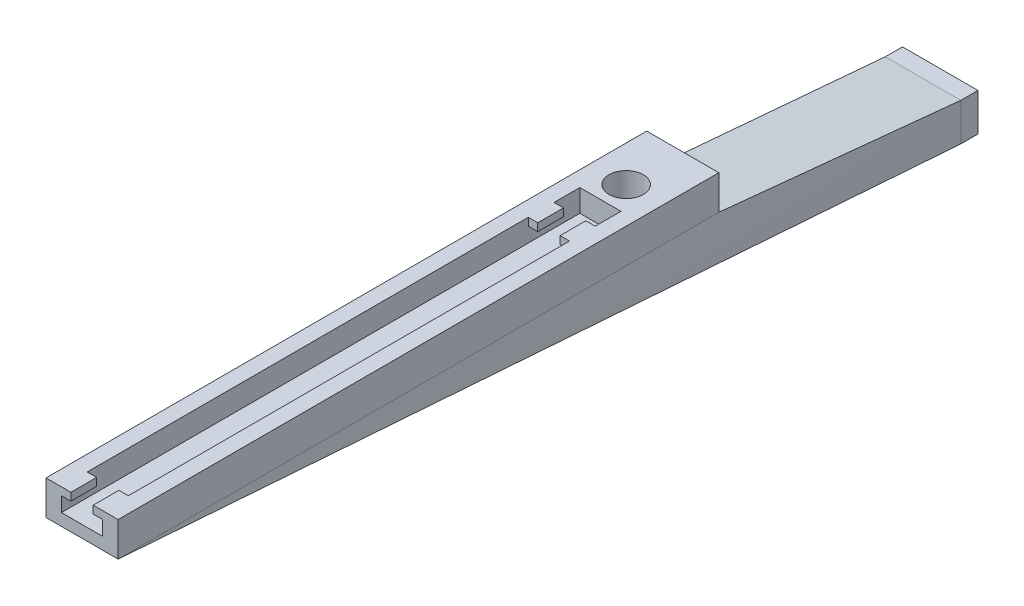
ISO-10303-21;
HEADER;
FILE_DESCRIPTION(('STEP AP214'),'2;1');
FILE_NAME('part.step','',(''),(''),'','','');
FILE_SCHEMA(('AUTOMOTIVE_DESIGN { 1 0 10303 214 1 1 1 1 }'));
ENDSEC;
DATA;
#1=APPLICATION_CONTEXT('core data for automotive mechanical design processes');
#2=APPLICATION_PROTOCOL_DEFINITION('international standard','automotive_design',2000,#1);
#3=PRODUCT_CONTEXT('',#1,'mechanical');
#4=PRODUCT('Part','Part','',(#3));
#5=PRODUCT_RELATED_PRODUCT_CATEGORY('part','',(#4));
#6=PRODUCT_DEFINITION_FORMATION('','',#4);
#7=PRODUCT_DEFINITION_CONTEXT('part definition',#1,'design');
#8=PRODUCT_DEFINITION('design','',#6,#7);
#9=PRODUCT_DEFINITION_SHAPE('','',#8);
#10=(LENGTH_UNIT() NAMED_UNIT(*) SI_UNIT(.MILLI.,.METRE.));
#11=(NAMED_UNIT(*) PLANE_ANGLE_UNIT() SI_UNIT($,.RADIAN.));
#12=(NAMED_UNIT(*) SI_UNIT($,.STERADIAN.) SOLID_ANGLE_UNIT());
#13=UNCERTAINTY_MEASURE_WITH_UNIT(LENGTH_MEASURE(1.E-05),#10,'distance_accuracy_value','');
#14=(GEOMETRIC_REPRESENTATION_CONTEXT(3) GLOBAL_UNCERTAINTY_ASSIGNED_CONTEXT((#13)) GLOBAL_UNIT_ASSIGNED_CONTEXT((#10,
#11,#12)) REPRESENTATION_CONTEXT('',''));
#15=CARTESIAN_POINT('',(0.,0.,0.));
#16=DIRECTION('',(0.,0.,1.));
#17=DIRECTION('',(1.,0.,0.));
#18=AXIS2_PLACEMENT_3D('',#15,#16,#17);
#19=CARTESIAN_POINT('',(3.25,22.,99.));
#20=DIRECTION('',(1.,0.,0.));
#21=DIRECTION('',(0.,1.,0.));
#22=AXIS2_PLACEMENT_3D('',#19,#20,#21);
#23=PLANE('',#22);
#24=DIRECTION('',(0.,1.,0.));
#25=VECTOR('',#24,1.);
#26=CARTESIAN_POINT('',(3.24999999999999,-5.5010249999999,106.5));
#27=LINE('',#26,#25);
#28=CARTESIAN_POINT('',(3.25,19.75,106.5));
#29=VERTEX_POINT('',#28);
#30=CARTESIAN_POINT('',(3.25,22.,106.5));
#31=VERTEX_POINT('',#30);
#32=EDGE_CURVE('E538',#29,#31,#27,.T.);
#33=ORIENTED_EDGE('',*,*,#32,.F.);
#34=DIRECTION('',(0.,0.,1.));
#35=VECTOR('',#34,1.);
#36=CARTESIAN_POINT('',(3.25,19.75,99.));
#37=LINE('',#36,#35);
#38=CARTESIAN_POINT('',(3.25,19.75,114.));
#39=VERTEX_POINT('',#38);
#40=EDGE_CURVE('E508',#29,#39,#37,.T.);
#41=ORIENTED_EDGE('',*,*,#40,.T.);
#42=DIRECTION('',(0.,-1.,0.));
#43=VECTOR('',#42,1.);
#44=CARTESIAN_POINT('',(3.24999999999999,-5.5010249999999,114.));
#45=LINE('',#44,#43);
#46=CARTESIAN_POINT('',(3.25,22.,114.));
#47=VERTEX_POINT('',#46);
#48=EDGE_CURVE('E566',#47,#39,#45,.T.);
#49=ORIENTED_EDGE('',*,*,#48,.F.);
#50=DIRECTION('',(0.,0.,1.));
#51=VECTOR('',#50,1.);
#52=CARTESIAN_POINT('',(3.25,22.,99.));
#53=LINE('',#52,#51);
#54=EDGE_CURVE('E263',#31,#47,#53,.T.);
#55=ORIENTED_EDGE('',*,*,#54,.F.);
#56=EDGE_LOOP('',(#33,#41,#49,#55));
#57=FACE_BOUND('',#56,.T.);
#58=ADVANCED_FACE('F50',(#57),#23,.F.);
#59=DIRECTION('',(0.,1.,0.));
#60=VECTOR('',#59,1.);
#61=CARTESIAN_POINT('',(3.24999999999999,-5.5010249999999,242.5));
#62=LINE('',#61,#60);
#63=CARTESIAN_POINT('',(3.25,19.75,242.5));
#64=VERTEX_POINT('',#63);
#65=CARTESIAN_POINT('',(3.25,22.,242.5));
#66=VERTEX_POINT('',#65);
#67=EDGE_CURVE('E568',#64,#66,#62,.T.);
#68=ORIENTED_EDGE('',*,*,#67,.F.);
#69=CARTESIAN_POINT('',(3.25,19.75,250.));
#70=VERTEX_POINT('',#69);
#71=EDGE_CURVE('E509',#64,#70,#37,.T.);
#72=ORIENTED_EDGE('',*,*,#71,.T.);
#73=DIRECTION('',(0.,1.,0.));
#74=VECTOR('',#73,1.);
#75=CARTESIAN_POINT('',(3.25,22.,250.));
#76=LINE('',#75,#74);
#77=CARTESIAN_POINT('',(3.25,22.,250.));
#78=VERTEX_POINT('',#77);
#79=EDGE_CURVE('E504',#70,#78,#76,.T.);
#80=ORIENTED_EDGE('',*,*,#79,.T.);
#81=EDGE_CURVE('E411',#66,#78,#53,.T.);
#82=ORIENTED_EDGE('',*,*,#81,.F.);
#83=EDGE_LOOP('',(#68,#72,#80,#82));
#84=FACE_BOUND('',#83,.T.);
#85=ADVANCED_FACE('F616',(#84),#23,.F.);
#86=CARTESIAN_POINT('',(3.25,19.75,99.));
#87=DIRECTION('',(0.,1.,0.));
#88=DIRECTION('',(0.,0.,1.));
#89=AXIS2_PLACEMENT_3D('',#86,#87,#88);
#90=PLANE('',#89);
#91=DIRECTION('',(-1.,0.,0.));
#92=VECTOR('',#91,1.);
#93=CARTESIAN_POINT('',(6.0000000000011,19.75,106.5));
#94=LINE('',#93,#92);
#95=CARTESIAN_POINT('',(5.99999999999989,19.75,106.5));
#96=VERTEX_POINT('',#95);
#97=EDGE_CURVE('E537',#96,#29,#94,.T.);
#98=ORIENTED_EDGE('',*,*,#97,.F.);
#99=DIRECTION('',(0.,0.,1.));
#100=VECTOR('',#99,1.);
#101=CARTESIAN_POINT('',(5.99999999999989,19.75,99.));
#102=LINE('',#101,#100);
#103=CARTESIAN_POINT('',(5.99999999999989,19.75,114.));
#104=VERTEX_POINT('',#103);
#105=EDGE_CURVE('E515',#96,#104,#102,.T.);
#106=ORIENTED_EDGE('',*,*,#105,.T.);
#107=DIRECTION('',(1.,0.,0.));
#108=VECTOR('',#107,1.);
#109=CARTESIAN_POINT('',(-6.00000000000002,19.75,114.));
#110=LINE('',#109,#108);
#111=EDGE_CURVE('E564',#39,#104,#110,.T.);
#112=ORIENTED_EDGE('',*,*,#111,.F.);
#113=ORIENTED_EDGE('',*,*,#40,.F.);
#114=EDGE_LOOP('',(#98,#106,#112,#113));
#115=FACE_BOUND('',#114,.T.);
#116=ADVANCED_FACE('F600',(#115),#90,.F.);
#117=DIRECTION('',(-1.,0.,0.));
#118=VECTOR('',#117,1.);
#119=CARTESIAN_POINT('',(6.,19.75,242.5));
#120=LINE('',#119,#118);
#121=CARTESIAN_POINT('',(5.99999999999989,19.75,242.5));
#122=VERTEX_POINT('',#121);
#123=EDGE_CURVE('E563',#122,#64,#120,.T.);
#124=ORIENTED_EDGE('',*,*,#123,.F.);
#125=CARTESIAN_POINT('',(5.99999999999989,19.75,250.));
#126=VERTEX_POINT('',#125);
#127=EDGE_CURVE('E514',#122,#126,#102,.T.);
#128=ORIENTED_EDGE('',*,*,#127,.T.);
#129=DIRECTION('',(-1.,0.,0.));
#130=VECTOR('',#129,1.);
#131=CARTESIAN_POINT('',(3.25,19.75,250.));
#132=LINE('',#131,#130);
#133=EDGE_CURVE('E505',#126,#70,#132,.T.);
#134=ORIENTED_EDGE('',*,*,#133,.T.);
#135=ORIENTED_EDGE('',*,*,#71,.F.);
#136=EDGE_LOOP('',(#124,#128,#134,#135));
#137=FACE_BOUND('',#136,.T.);
#138=ADVANCED_FACE('F614',(#137),#90,.F.);
#139=CARTESIAN_POINT('',(-3.25,19.75,99.));
#140=DIRECTION('',(0.,1.,0.));
#141=DIRECTION('',(0.,0.,1.));
#142=AXIS2_PLACEMENT_3D('',#139,#140,#141);
#143=PLANE('',#142);
#144=DIRECTION('',(-1.,0.,0.));
#145=VECTOR('',#144,1.);
#146=CARTESIAN_POINT('',(6.,19.75,242.5));
#147=LINE('',#146,#145);
#148=CARTESIAN_POINT('',(-3.25,19.75,242.5));
#149=VERTEX_POINT('',#148);
#150=CARTESIAN_POINT('',(-5.99999999999989,19.75,242.5));
#151=VERTEX_POINT('',#150);
#152=EDGE_CURVE('E553',#149,#151,#147,.T.);
#153=ORIENTED_EDGE('',*,*,#152,.F.);
#154=DIRECTION('',(0.,0.,1.));
#155=VECTOR('',#154,1.);
#156=CARTESIAN_POINT('',(-3.25,19.75,99.));
#157=LINE('',#156,#155);
#158=CARTESIAN_POINT('',(-3.25,19.75,250.));
#159=VERTEX_POINT('',#158);
#160=EDGE_CURVE('E247',#149,#159,#157,.T.);
#161=ORIENTED_EDGE('',*,*,#160,.T.);
#162=DIRECTION('',(-1.,0.,0.));
#163=VECTOR('',#162,1.);
#164=CARTESIAN_POINT('',(-3.25,19.75,250.));
#165=LINE('',#164,#163);
#166=CARTESIAN_POINT('',(-5.99999999999989,19.75,250.));
#167=VERTEX_POINT('',#166);
#168=EDGE_CURVE('E483',#159,#167,#165,.T.);
#169=ORIENTED_EDGE('',*,*,#168,.T.);
#170=DIRECTION('',(0.,0.,1.));
#171=VECTOR('',#170,1.);
#172=CARTESIAN_POINT('',(-5.99999999999989,19.75,99.));
#173=LINE('',#172,#171);
#174=EDGE_CURVE('E250',#151,#167,#173,.T.);
#175=ORIENTED_EDGE('',*,*,#174,.F.);
#176=EDGE_LOOP('',(#153,#161,#169,#175));
#177=FACE_BOUND('',#176,.T.);
#178=ADVANCED_FACE('F643',(#177),#143,.F.);
#179=DIRECTION('',(1.,0.,0.));
#180=VECTOR('',#179,1.);
#181=CARTESIAN_POINT('',(-6.00000000000002,19.75,114.));
#182=LINE('',#181,#180);
#183=CARTESIAN_POINT('',(-5.99999999999989,19.75,114.));
#184=VERTEX_POINT('',#183);
#185=CARTESIAN_POINT('',(-3.25,19.75,114.));
#186=VERTEX_POINT('',#185);
#187=EDGE_CURVE('E555',#184,#186,#182,.T.);
#188=ORIENTED_EDGE('',*,*,#187,.F.);
#189=CARTESIAN_POINT('',(-5.99999999999989,19.75,106.5));
#190=VERTEX_POINT('',#189);
#191=EDGE_CURVE('E245',#190,#184,#173,.T.);
#192=ORIENTED_EDGE('',*,*,#191,.F.);
#193=DIRECTION('',(-1.,0.,0.));
#194=VECTOR('',#193,1.);
#195=CARTESIAN_POINT('',(6.0000000000011,19.75,106.5));
#196=LINE('',#195,#194);
#197=CARTESIAN_POINT('',(-3.25,19.75,106.5));
#198=VERTEX_POINT('',#197);
#199=EDGE_CURVE('E224',#198,#190,#196,.T.);
#200=ORIENTED_EDGE('',*,*,#199,.F.);
#201=EDGE_CURVE('E239',#198,#186,#157,.T.);
#202=ORIENTED_EDGE('',*,*,#201,.T.);
#203=EDGE_LOOP('',(#188,#192,#200,#202));
#204=FACE_BOUND('',#203,.T.);
#205=ADVANCED_FACE('F237',(#204),#143,.F.);
#206=CARTESIAN_POINT('',(-3.25,22.,99.));
#207=DIRECTION('',(-1.,0.,0.));
#208=DIRECTION('',(0.,-1.,0.));
#209=AXIS2_PLACEMENT_3D('',#206,#207,#208);
#210=PLANE('',#209);
#211=DIRECTION('',(0.,-1.,0.));
#212=VECTOR('',#211,1.);
#213=CARTESIAN_POINT('',(-3.24999999999999,-5.5010249999999,242.5));
#214=LINE('',#213,#212);
#215=CARTESIAN_POINT('',(-3.25,22.,242.5));
#216=VERTEX_POINT('',#215);
#217=EDGE_CURVE('E547',#216,#149,#214,.T.);
#218=ORIENTED_EDGE('',*,*,#217,.F.);
#219=DIRECTION('',(0.,0.,1.));
#220=VECTOR('',#219,1.);
#221=CARTESIAN_POINT('',(-3.25,22.,99.));
#222=LINE('',#221,#220);
#223=CARTESIAN_POINT('',(-3.25,22.,250.));
#224=VERTEX_POINT('',#223);
#225=EDGE_CURVE('E251',#216,#224,#222,.T.);
#226=ORIENTED_EDGE('',*,*,#225,.T.);
#227=DIRECTION('',(0.,-1.,0.));
#228=VECTOR('',#227,1.);
#229=CARTESIAN_POINT('',(-3.25,22.,250.));
#230=LINE('',#229,#228);
#231=EDGE_CURVE('E476',#224,#159,#230,.T.);
#232=ORIENTED_EDGE('',*,*,#231,.T.);
#233=ORIENTED_EDGE('',*,*,#160,.F.);
#234=EDGE_LOOP('',(#218,#226,#232,#233));
#235=FACE_BOUND('',#234,.T.);
#236=ADVANCED_FACE('F652',(#235),#210,.F.);
#237=DIRECTION('',(0.,1.,0.));
#238=VECTOR('',#237,1.);
#239=CARTESIAN_POINT('',(-3.24999999999999,-5.5010249999999,114.));
#240=LINE('',#239,#238);
#241=CARTESIAN_POINT('',(-3.25,22.,114.));
#242=VERTEX_POINT('',#241);
#243=EDGE_CURVE('E246',#186,#242,#240,.T.);
#244=ORIENTED_EDGE('',*,*,#243,.F.);
#245=ORIENTED_EDGE('',*,*,#201,.F.);
#246=DIRECTION('',(0.,-1.,0.));
#247=VECTOR('',#246,1.);
#248=CARTESIAN_POINT('',(-3.25,-5.5010249999999,106.5));
#249=LINE('',#248,#247);
#250=CARTESIAN_POINT('',(-3.25,22.,106.5));
#251=VERTEX_POINT('',#250);
#252=EDGE_CURVE('E225',#251,#198,#249,.T.);
#253=ORIENTED_EDGE('',*,*,#252,.F.);
#254=EDGE_CURVE('E252',#251,#242,#222,.T.);
#255=ORIENTED_EDGE('',*,*,#254,.T.);
#256=EDGE_LOOP('',(#244,#245,#253,#255));
#257=FACE_BOUND('',#256,.T.);
#258=ADVANCED_FACE('F244',(#257),#210,.F.);
#259=CARTESIAN_POINT('',(0.,22.,0.));
#260=DIRECTION('',(0.,1.,0.));
#261=DIRECTION('',(0.,0.,1.));
#262=AXIS2_PLACEMENT_3D('',#259,#260,#261);
#263=PLANE('',#262);
#264=DIRECTION('',(-1.,0.,0.));
#265=VECTOR('',#264,1.);
#266=CARTESIAN_POINT('',(-3.25,22.,99.));
#267=LINE('',#266,#265);
#268=CARTESIAN_POINT('',(6.00000000000105,22.,99.));
#269=VERTEX_POINT('',#268);
#270=CARTESIAN_POINT('',(-6.00000000000037,22.,99.));
#271=VERTEX_POINT('',#270);
#272=EDGE_CURVE('E510',#269,#271,#267,.T.);
#273=ORIENTED_EDGE('',*,*,#272,.F.);
#274=DIRECTION('',(0.,0.,-1.));
#275=VECTOR('',#274,1.);
#276=CARTESIAN_POINT('',(6.0000000000011,22.,106.5));
#277=LINE('',#276,#275);
#278=CARTESIAN_POINT('',(6.0000000000011,22.,106.5));
#279=VERTEX_POINT('',#278);
#280=EDGE_CURVE('E531',#279,#269,#277,.T.);
#281=ORIENTED_EDGE('',*,*,#280,.F.);
#282=DIRECTION('',(1.,0.,0.));
#283=VECTOR('',#282,1.);
#284=CARTESIAN_POINT('',(6.0000000000011,22.,106.5));
#285=LINE('',#284,#283);
#286=EDGE_CURVE('E61',#31,#279,#285,.T.);
#287=ORIENTED_EDGE('',*,*,#286,.F.);
#288=ORIENTED_EDGE('',*,*,#54,.T.);
#289=DIRECTION('',(-1.,0.,0.));
#290=VECTOR('',#289,1.);
#291=CARTESIAN_POINT('',(-6.00000000000002,22.,114.));
#292=LINE('',#291,#290);
#293=CARTESIAN_POINT('',(6.0000000000008,22.,114.));
#294=VERTEX_POINT('',#293);
#295=EDGE_CURVE('E535',#294,#47,#292,.T.);
#296=ORIENTED_EDGE('',*,*,#295,.F.);
#297=DIRECTION('',(0.,0.,-1.));
#298=VECTOR('',#297,1.);
#299=CARTESIAN_POINT('',(6.,22.,242.5));
#300=LINE('',#299,#298);
#301=CARTESIAN_POINT('',(6.,22.,242.5));
#302=VERTEX_POINT('',#301);
#303=EDGE_CURVE('E559',#302,#294,#300,.T.);
#304=ORIENTED_EDGE('',*,*,#303,.F.);
#305=DIRECTION('',(1.,0.,0.));
#306=VECTOR('',#305,1.);
#307=CARTESIAN_POINT('',(6.,22.,242.5));
#308=LINE('',#307,#306);
#309=EDGE_CURVE('E556',#66,#302,#308,.T.);
#310=ORIENTED_EDGE('',*,*,#309,.F.);
#311=ORIENTED_EDGE('',*,*,#81,.T.);
#312=DIRECTION('',(1.,0.,0.));
#313=VECTOR('',#312,1.);
#314=CARTESIAN_POINT('',(-10.5,22.,250.));
#315=LINE('',#314,#313);
#316=CARTESIAN_POINT('',(10.5,22.,250.));
#317=VERTEX_POINT('',#316);
#318=EDGE_CURVE('E270',#78,#317,#315,.T.);
#319=ORIENTED_EDGE('',*,*,#318,.T.);
#320=DIRECTION('',(0.,0.,-1.));
#321=VECTOR('',#320,1.);
#322=CARTESIAN_POINT('',(10.5,22.,75.));
#323=LINE('',#322,#321);
#324=CARTESIAN_POINT('',(10.5,22.,75.));
#325=VERTEX_POINT('',#324);
#326=EDGE_CURVE('E259',#317,#325,#323,.T.);
#327=ORIENTED_EDGE('',*,*,#326,.T.);
#328=DIRECTION('',(-1.,0.,0.));
#329=VECTOR('',#328,1.);
#330=CARTESIAN_POINT('',(-10.5,22.,75.));
#331=LINE('',#330,#329);
#332=CARTESIAN_POINT('',(-10.5,22.,75.));
#333=VERTEX_POINT('',#332);
#334=EDGE_CURVE('E256',#325,#333,#331,.T.);
#335=ORIENTED_EDGE('',*,*,#334,.T.);
#336=DIRECTION('',(0.,0.,1.));
#337=VECTOR('',#336,1.);
#338=CARTESIAN_POINT('',(-10.5,22.,75.));
#339=LINE('',#338,#337);
#340=CARTESIAN_POINT('',(-10.5,22.,250.));
#341=VERTEX_POINT('',#340);
#342=EDGE_CURVE('E262',#333,#341,#339,.T.);
#343=ORIENTED_EDGE('',*,*,#342,.T.);
#344=EDGE_CURVE('E266',#341,#224,#315,.T.);
#345=ORIENTED_EDGE('',*,*,#344,.T.);
#346=ORIENTED_EDGE('',*,*,#225,.F.);
#347=DIRECTION('',(1.,0.,0.));
#348=VECTOR('',#347,1.);
#349=CARTESIAN_POINT('',(6.,22.,242.5));
#350=LINE('',#349,#348);
#351=CARTESIAN_POINT('',(-6.,22.,242.5));
#352=VERTEX_POINT('',#351);
#353=EDGE_CURVE('E545',#352,#216,#350,.T.);
#354=ORIENTED_EDGE('',*,*,#353,.F.);
#355=DIRECTION('',(0.,0.,1.));
#356=VECTOR('',#355,1.);
#357=CARTESIAN_POINT('',(-6.,22.,242.5));
#358=LINE('',#357,#356);
#359=CARTESIAN_POINT('',(-6.00000000000002,22.,114.));
#360=VERTEX_POINT('',#359);
#361=EDGE_CURVE('E542',#360,#352,#358,.T.);
#362=ORIENTED_EDGE('',*,*,#361,.F.);
#363=DIRECTION('',(-1.,0.,0.));
#364=VECTOR('',#363,1.);
#365=CARTESIAN_POINT('',(-6.00000000000002,22.,114.));
#366=LINE('',#365,#364);
#367=EDGE_CURVE('E71',#242,#360,#366,.T.);
#368=ORIENTED_EDGE('',*,*,#367,.F.);
#369=ORIENTED_EDGE('',*,*,#254,.F.);
#370=DIRECTION('',(1.,0.,0.));
#371=VECTOR('',#370,1.);
#372=CARTESIAN_POINT('',(6.0000000000011,22.,106.5));
#373=LINE('',#372,#371);
#374=CARTESIAN_POINT('',(-6.00000000000037,22.,106.5));
#375=VERTEX_POINT('',#374);
#376=EDGE_CURVE('E226',#375,#251,#373,.T.);
#377=ORIENTED_EDGE('',*,*,#376,.F.);
#378=DIRECTION('',(0.,0.,1.));
#379=VECTOR('',#378,1.);
#380=CARTESIAN_POINT('',(-6.00000000000037,22.,106.5));
#381=LINE('',#380,#379);
#382=EDGE_CURVE('E528',#271,#375,#381,.T.);
#383=ORIENTED_EDGE('',*,*,#382,.F.);
#384=EDGE_LOOP('',(#273,#281,#287,#288,#296,#304,#310,#311,#319,#327,#335,#343,#345,#346,#354,
#362,#368,#369,#377,#383));
#385=FACE_BOUND('',#384,.T.);
#386=CARTESIAN_POINT('',(0.,22.,91.5));
#387=DIRECTION('',(0.,1.,0.));
#388=DIRECTION('',(0.,0.,1.));
#389=AXIS2_PLACEMENT_3D('',#386,#387,#388);
#390=CIRCLE('',#389,5.00000000000001);
#391=CARTESIAN_POINT('',(0.,22.,96.5));
#392=VERTEX_POINT('',#391);
#393=EDGE_CURVE('E490',#392,#392,#390,.T.);
#394=ORIENTED_EDGE('',*,*,#393,.F.);
#395=EDGE_LOOP('',(#394));
#396=FACE_BOUND('',#395,.T.);
#397=ADVANCED_FACE('F409',(#385,#396),#263,.T.);
#398=CARTESIAN_POINT('',(11.,5.5,5.));
#399=DIRECTION('',(0.,-1.,0.));
#400=DIRECTION('',(0.,0.,-1.));
#401=AXIS2_PLACEMENT_3D('',#398,#399,#400);
#402=PLANE('',#401);
#403=DIRECTION('',(-1.,0.,0.));
#404=VECTOR('',#403,1.);
#405=CARTESIAN_POINT('',(11.,5.5,0.));
#406=LINE('',#405,#404);
#407=CARTESIAN_POINT('',(11.,5.5,0.));
#408=VERTEX_POINT('',#407);
#409=CARTESIAN_POINT('',(-11.,5.5,0.));
#410=VERTEX_POINT('',#409);
#411=EDGE_CURVE('E273',#408,#410,#406,.T.);
#412=ORIENTED_EDGE('',*,*,#411,.T.);
#413=DIRECTION('',(0.,0.,-1.));
#414=VECTOR('',#413,1.);
#415=CARTESIAN_POINT('',(-11.,5.5,5.));
#416=LINE('',#415,#414);
#417=CARTESIAN_POINT('',(-11.,5.5,5.));
#418=VERTEX_POINT('',#417);
#419=EDGE_CURVE('E12',#418,#410,#416,.T.);
#420=ORIENTED_EDGE('',*,*,#419,.F.);
#421=DIRECTION('',(1.,0.,0.));
#422=VECTOR('',#421,1.);
#423=CARTESIAN_POINT('',(0.,5.5,5.));
#424=LINE('',#423,#422);
#425=CARTESIAN_POINT('',(11.,5.5,5.));
#426=VERTEX_POINT('',#425);
#427=EDGE_CURVE('E429',#426,#418,#424,.F.);
#428=ORIENTED_EDGE('',*,*,#427,.F.);
#429=DIRECTION('',(0.,0.,-1.));
#430=VECTOR('',#429,1.);
#431=CARTESIAN_POINT('',(11.,5.5,5.));
#432=LINE('',#431,#430);
#433=EDGE_CURVE('E434',#426,#408,#432,.T.);
#434=ORIENTED_EDGE('',*,*,#433,.T.);
#435=EDGE_LOOP('',(#412,#420,#428,#434));
#436=FACE_BOUND('',#435,.T.);
#437=ADVANCED_FACE('F47',(#436),#402,.F.);
#438=CARTESIAN_POINT('',(-11.,-5.5,5.));
#439=DIRECTION('',(1.,0.,0.));
#440=DIRECTION('',(0.,0.,-1.));
#441=AXIS2_PLACEMENT_3D('',#438,#439,#440);
#442=PLANE('',#441);
#443=DIRECTION('',(0.,-1.,0.));
#444=VECTOR('',#443,1.);
#445=CARTESIAN_POINT('',(-11.,-5.5,0.));
#446=LINE('',#445,#444);
#447=CARTESIAN_POINT('',(-11.,-5.5,0.));
#448=VERTEX_POINT('',#447);
#449=EDGE_CURVE('E446',#410,#448,#446,.T.);
#450=ORIENTED_EDGE('',*,*,#449,.T.);
#451=DIRECTION('',(0.,0.,-1.));
#452=VECTOR('',#451,1.);
#453=CARTESIAN_POINT('',(-11.,-5.5,5.));
#454=LINE('',#453,#452);
#455=CARTESIAN_POINT('',(-11.,-5.4999999999999,5.00000000000274));
#456=VERTEX_POINT('',#455);
#457=EDGE_CURVE('E60',#456,#448,#454,.T.);
#458=ORIENTED_EDGE('',*,*,#457,.F.);
#459=DIRECTION('',(0.,1.,0.));
#460=VECTOR('',#459,1.);
#461=CARTESIAN_POINT('',(-11.,-5.5,5.));
#462=LINE('',#461,#460);
#463=EDGE_CURVE('E421',#418,#456,#462,.F.);
#464=ORIENTED_EDGE('',*,*,#463,.F.);
#465=ORIENTED_EDGE('',*,*,#419,.T.);
#466=EDGE_LOOP('',(#450,#458,#464,#465));
#467=FACE_BOUND('',#466,.T.);
#468=ADVANCED_FACE('F459',(#467),#442,.F.);
#469=CARTESIAN_POINT('',(11.,-5.5,5.));
#470=DIRECTION('',(0.,1.,0.));
#471=DIRECTION('',(0.,0.,1.));
#472=AXIS2_PLACEMENT_3D('',#469,#470,#471);
#473=PLANE('',#472);
#474=DIRECTION('',(1.,0.,0.));
#475=VECTOR('',#474,1.);
#476=CARTESIAN_POINT('',(11.,-5.5,0.));
#477=LINE('',#476,#475);
#478=CARTESIAN_POINT('',(11.,-5.5,0.));
#479=VERTEX_POINT('',#478);
#480=EDGE_CURVE('E450',#448,#479,#477,.T.);
#481=ORIENTED_EDGE('',*,*,#480,.T.);
#482=DIRECTION('',(0.,0.,-1.));
#483=VECTOR('',#482,1.);
#484=CARTESIAN_POINT('',(11.,-5.5,5.));
#485=LINE('',#484,#483);
#486=CARTESIAN_POINT('',(11.,-5.4999999999999,5.00000000000274));
#487=VERTEX_POINT('',#486);
#488=EDGE_CURVE('E441',#487,#479,#485,.T.);
#489=ORIENTED_EDGE('',*,*,#488,.F.);
#490=DIRECTION('',(1.,0.,0.));
#491=VECTOR('',#490,1.);
#492=CARTESIAN_POINT('',(0.,-5.5,5.));
#493=LINE('',#492,#491);
#494=EDGE_CURVE('E426',#456,#487,#493,.T.);
#495=ORIENTED_EDGE('',*,*,#494,.F.);
#496=ORIENTED_EDGE('',*,*,#457,.T.);
#497=EDGE_LOOP('',(#481,#489,#495,#496));
#498=FACE_BOUND('',#497,.T.);
#499=ADVANCED_FACE('F874',(#498),#473,.F.);
#500=CARTESIAN_POINT('',(11.,-5.5,5.));
#501=DIRECTION('',(-1.,0.,0.));
#502=DIRECTION('',(0.,0.,1.));
#503=AXIS2_PLACEMENT_3D('',#500,#501,#502);
#504=PLANE('',#503);
#505=DIRECTION('',(0.,1.,0.));
#506=VECTOR('',#505,1.);
#507=CARTESIAN_POINT('',(11.,-5.5,0.));
#508=LINE('',#507,#506);
#509=EDGE_CURVE('E440',#479,#408,#508,.T.);
#510=ORIENTED_EDGE('',*,*,#509,.T.);
#511=ORIENTED_EDGE('',*,*,#433,.F.);
#512=DIRECTION('',(0.,1.,0.));
#513=VECTOR('',#512,1.);
#514=CARTESIAN_POINT('',(11.,-5.5,5.));
#515=LINE('',#514,#513);
#516=EDGE_CURVE('E435',#487,#426,#515,.T.);
#517=ORIENTED_EDGE('',*,*,#516,.F.);
#518=ORIENTED_EDGE('',*,*,#488,.T.);
#519=EDGE_LOOP('',(#510,#511,#517,#518));
#520=FACE_BOUND('',#519,.T.);
#521=ADVANCED_FACE('F474',(#520),#504,.F.);
#522=CARTESIAN_POINT('',(0.,0.,0.));
#523=DIRECTION('',(0.,0.,-1.));
#524=DIRECTION('',(-1.,0.,0.));
#525=AXIS2_PLACEMENT_3D('',#522,#523,#524);
#526=PLANE('',#525);
#527=ORIENTED_EDGE('',*,*,#411,.F.);
#528=ORIENTED_EDGE('',*,*,#509,.F.);
#529=ORIENTED_EDGE('',*,*,#480,.F.);
#530=ORIENTED_EDGE('',*,*,#449,.F.);
#531=EDGE_LOOP('',(#527,#528,#529,#530));
#532=FACE_BOUND('',#531,.T.);
#533=ADVANCED_FACE('F460',(#532),#526,.T.);
#534=CARTESIAN_POINT('',(0.,-5.82741116751269,0.416243654822335));
#535=DIRECTION('',(0.,-0.997458699830735,0.0712470499879096));
#536=DIRECTION('',(0.,-0.0712470499879096,-0.997458699830735));
#537=AXIS2_PLACEMENT_3D('',#534,#535,#536);
#538=PLANE('',#537);
#539=DIRECTION('',(-0.00203562578205654,-0.0712469023719797,-0.997456633207716));
#540=VECTOR('',#539,1.);
#541=CARTESIAN_POINT('',(-10.5,12.,250.));
#542=LINE('',#541,#540);
#543=CARTESIAN_POINT('',(-10.5,12.,250.));
#544=VERTEX_POINT('',#543);
#545=EDGE_CURVE('E353',#544,#456,#542,.T.);
#546=ORIENTED_EDGE('',*,*,#545,.T.);
#547=ORIENTED_EDGE('',*,*,#494,.T.);
#548=DIRECTION('',(0.00203562578205658,-0.0712469023719797,-0.997456633207716));
#549=VECTOR('',#548,1.);
#550=CARTESIAN_POINT('',(10.5,12.,250.));
#551=LINE('',#550,#549);
#552=CARTESIAN_POINT('',(10.5,12.,250.));
#553=VERTEX_POINT('',#552);
#554=EDGE_CURVE('E283',#553,#487,#551,.T.);
#555=ORIENTED_EDGE('',*,*,#554,.F.);
#556=DIRECTION('',(1.,0.,0.));
#557=VECTOR('',#556,1.);
#558=CARTESIAN_POINT('',(-10.5,12.,250.));
#559=LINE('',#558,#557);
#560=EDGE_CURVE('E345',#544,#553,#559,.T.);
#561=ORIENTED_EDGE('',*,*,#560,.F.);
#562=EDGE_LOOP('',(#546,#547,#555,#561));
#563=FACE_BOUND('',#562,.T.);
#564=ADVANCED_FACE('F307',(#563),#538,.T.);
#565=CARTESIAN_POINT('',(10.5,12.,75.));
#566=CARTESIAN_POINT('',(11.,5.5,5.));
#567=CARTESIAN_POINT('',(10.5,12.,104.166666666667));
#568=CARTESIAN_POINT('',(11.,3.66666666666667,5.));
#569=CARTESIAN_POINT('',(10.5,12.,133.333333333333));
#570=CARTESIAN_POINT('',(11.,1.83333333333333,5.));
#571=CARTESIAN_POINT('',(10.5,12.,191.666666666667));
#572=CARTESIAN_POINT('',(11.,-1.83333333333333,5.));
#573=CARTESIAN_POINT('',(10.5,12.,220.833333333333));
#574=CARTESIAN_POINT('',(11.,-3.66666666666667,5.));
#575=CARTESIAN_POINT('',(10.5,12.,250.));
#576=CARTESIAN_POINT('',(11.,-5.5,5.));
#577=B_SPLINE_SURFACE_WITH_KNOTS('',3,1,((#565,#566),(#567,#568),(#569,#570),(#571,#572),(#573,
#574),(#575,#576)),.UNSPECIFIED.,.F.,.F.,.F.,(4,2,4),(2,2),(0.,0.5,1.),(0.,1.),.UNSPECIFIED.);
#578=DIRECTION('',(0.,0.,-1.));
#579=VECTOR('',#578,1.);
#580=CARTESIAN_POINT('',(10.5,12.,75.));
#581=LINE('',#580,#579);
#582=CARTESIAN_POINT('',(10.5,12.,75.));
#583=VERTEX_POINT('',#582);
#584=EDGE_CURVE('E287',#553,#583,#581,.T.);
#585=DIRECTION('',(0.00711208052741447,-0.092457046856387,-0.995691273838014));
#586=VECTOR('',#585,1.);
#587=CARTESIAN_POINT('',(10.5,12.,75.));
#588=LINE('',#587,#586);
#589=EDGE_CURVE('E275',#583,#426,#588,.T.);
#590=ORIENTED_EDGE('',*,*,#584,.F.);
#591=ORIENTED_EDGE('',*,*,#554,.T.);
#592=ORIENTED_EDGE('',*,*,#516,.T.);
#593=ORIENTED_EDGE('',*,*,#589,.F.);
#594=EDGE_LOOP('',(#590,#591,#592,#593));
#595=FACE_BOUND('',#594,.T.);
#596=ADVANCED_FACE('F298',(#595),#577,.T.);
#597=CARTESIAN_POINT('',(-10.5,12.,250.));
#598=CARTESIAN_POINT('',(-11.,-5.5,5.));
#599=CARTESIAN_POINT('',(-10.5,12.,220.833333333333));
#600=CARTESIAN_POINT('',(-11.,-3.66666666666667,5.));
#601=CARTESIAN_POINT('',(-10.5,12.,191.666666666667));
#602=CARTESIAN_POINT('',(-11.,-1.83333333333334,5.));
#603=CARTESIAN_POINT('',(-10.5,12.,133.333333333333));
#604=CARTESIAN_POINT('',(-11.,1.83333333333332,5.));
#605=CARTESIAN_POINT('',(-10.5,12.,104.166666666667));
#606=CARTESIAN_POINT('',(-11.,3.66666666666666,5.));
#607=CARTESIAN_POINT('',(-10.5,12.,75.));
#608=CARTESIAN_POINT('',(-11.,5.5,5.));
#609=B_SPLINE_SURFACE_WITH_KNOTS('',3,1,((#597,#598),(#599,#600),(#601,#602),(#603,#604),(#605,
#606),(#607,#608)),.UNSPECIFIED.,.F.,.F.,.F.,(4,2,4),(2,2),(0.,0.5,1.),(0.,1.),.UNSPECIFIED.);
#610=DIRECTION('',(0.,0.,1.));
#611=VECTOR('',#610,1.);
#612=CARTESIAN_POINT('',(-10.5,12.,75.));
#613=LINE('',#612,#611);
#614=CARTESIAN_POINT('',(-10.5,12.,75.));
#615=VERTEX_POINT('',#614);
#616=EDGE_CURVE('E51',#615,#544,#613,.T.);
#617=DIRECTION('',(-0.00711208052741429,-0.092457046856387,-0.995691273838014));
#618=VECTOR('',#617,1.);
#619=CARTESIAN_POINT('',(-10.75,8.75,40.));
#620=LINE('',#619,#618);
#621=EDGE_CURVE('E278',#615,#418,#620,.T.);
#622=ORIENTED_EDGE('',*,*,#616,.F.);
#623=ORIENTED_EDGE('',*,*,#621,.T.);
#624=ORIENTED_EDGE('',*,*,#463,.T.);
#625=ORIENTED_EDGE('',*,*,#545,.F.);
#626=EDGE_LOOP('',(#622,#623,#624,#625));
#627=FACE_BOUND('',#626,.T.);
#628=ADVANCED_FACE('F308',(#627),#609,.T.);
#629=CARTESIAN_POINT('',(0.,4.99266528403055,-0.463604633517122));
#630=DIRECTION('',(0.,0.995716456666751,-0.0924593852619126));
#631=DIRECTION('',(0.,0.0924593852619126,0.995716456666751));
#632=AXIS2_PLACEMENT_3D('',#629,#630,#631);
#633=PLANE('',#632);
#634=ORIENTED_EDGE('',*,*,#589,.T.);
#635=ORIENTED_EDGE('',*,*,#427,.T.);
#636=ORIENTED_EDGE('',*,*,#621,.F.);
#637=DIRECTION('',(-1.,0.,0.));
#638=VECTOR('',#637,1.);
#639=CARTESIAN_POINT('',(-10.5,12.,75.));
#640=LINE('',#639,#638);
#641=EDGE_CURVE('E346',#583,#615,#640,.T.);
#642=ORIENTED_EDGE('',*,*,#641,.F.);
#643=EDGE_LOOP('',(#634,#635,#636,#642));
#644=FACE_BOUND('',#643,.T.);
#645=ADVANCED_FACE('F323',(#644),#633,.T.);
#646=CARTESIAN_POINT('',(10.5,12.,75.));
#647=DIRECTION('',(1.,0.,0.));
#648=DIRECTION('',(0.,0.,-1.));
#649=AXIS2_PLACEMENT_3D('',#646,#647,#648);
#650=PLANE('',#649);
#651=ORIENTED_EDGE('',*,*,#326,.F.);
#652=DIRECTION('',(0.,1.,0.));
#653=VECTOR('',#652,1.);
#654=CARTESIAN_POINT('',(10.5,12.,250.));
#655=LINE('',#654,#653);
#656=EDGE_CURVE('E341',#553,#317,#655,.T.);
#657=ORIENTED_EDGE('',*,*,#656,.F.);
#658=ORIENTED_EDGE('',*,*,#584,.T.);
#659=DIRECTION('',(0.,1.,0.));
#660=VECTOR('',#659,1.);
#661=CARTESIAN_POINT('',(10.5,12.,75.));
#662=LINE('',#661,#660);
#663=EDGE_CURVE('E272',#583,#325,#662,.T.);
#664=ORIENTED_EDGE('',*,*,#663,.T.);
#665=EDGE_LOOP('',(#651,#657,#658,#664));
#666=FACE_BOUND('',#665,.T.);
#667=ADVANCED_FACE('F359',(#666),#650,.T.);
#668=CARTESIAN_POINT('',(-10.5,12.,250.));
#669=DIRECTION('',(0.,0.,1.));
#670=DIRECTION('',(1.,0.,0.));
#671=AXIS2_PLACEMENT_3D('',#668,#669,#670);
#672=PLANE('',#671);
#673=ORIENTED_EDGE('',*,*,#231,.F.);
#674=ORIENTED_EDGE('',*,*,#344,.F.);
#675=DIRECTION('',(0.,1.,0.));
#676=VECTOR('',#675,1.);
#677=CARTESIAN_POINT('',(-10.5,12.,250.));
#678=LINE('',#677,#676);
#679=EDGE_CURVE('E398',#544,#341,#678,.T.);
#680=ORIENTED_EDGE('',*,*,#679,.F.);
#681=ORIENTED_EDGE('',*,*,#560,.T.);
#682=ORIENTED_EDGE('',*,*,#656,.T.);
#683=ORIENTED_EDGE('',*,*,#318,.F.);
#684=ORIENTED_EDGE('',*,*,#79,.F.);
#685=ORIENTED_EDGE('',*,*,#133,.F.);
#686=DIRECTION('',(0.,1.,0.));
#687=VECTOR('',#686,1.);
#688=CARTESIAN_POINT('',(5.99999999999989,19.75,250.));
#689=LINE('',#688,#687);
#690=CARTESIAN_POINT('',(5.99999999999988,15.5,250.));
#691=VERTEX_POINT('',#690);
#692=EDGE_CURVE('E497',#691,#126,#689,.T.);
#693=ORIENTED_EDGE('',*,*,#692,.F.);
#694=DIRECTION('',(1.,0.,0.));
#695=VECTOR('',#694,1.);
#696=CARTESIAN_POINT('',(-5.99999999999988,15.5,250.));
#697=LINE('',#696,#695);
#698=CARTESIAN_POINT('',(-5.99999999999988,15.5,250.));
#699=VERTEX_POINT('',#698);
#700=EDGE_CURVE('E496',#699,#691,#697,.T.);
#701=ORIENTED_EDGE('',*,*,#700,.F.);
#702=DIRECTION('',(0.,-1.,0.));
#703=VECTOR('',#702,1.);
#704=CARTESIAN_POINT('',(-5.99999999999989,19.75,250.));
#705=LINE('',#704,#703);
#706=EDGE_CURVE('E488',#167,#699,#705,.T.);
#707=ORIENTED_EDGE('',*,*,#706,.F.);
#708=ORIENTED_EDGE('',*,*,#168,.F.);
#709=EDGE_LOOP('',(#673,#674,#680,#681,#682,#683,#684,#685,#693,#701,#707,#708));
#710=FACE_BOUND('',#709,.T.);
#711=ADVANCED_FACE('F367',(#710),#672,.T.);
#712=CARTESIAN_POINT('',(-10.5,12.,75.));
#713=DIRECTION('',(-1.,0.,0.));
#714=DIRECTION('',(0.,0.,1.));
#715=AXIS2_PLACEMENT_3D('',#712,#713,#714);
#716=PLANE('',#715);
#717=ORIENTED_EDGE('',*,*,#342,.F.);
#718=DIRECTION('',(0.,1.,0.));
#719=VECTOR('',#718,1.);
#720=CARTESIAN_POINT('',(-10.5,12.,75.));
#721=LINE('',#720,#719);
#722=EDGE_CURVE('E390',#615,#333,#721,.T.);
#723=ORIENTED_EDGE('',*,*,#722,.F.);
#724=ORIENTED_EDGE('',*,*,#616,.T.);
#725=ORIENTED_EDGE('',*,*,#679,.T.);
#726=EDGE_LOOP('',(#717,#723,#724,#725));
#727=FACE_BOUND('',#726,.T.);
#728=ADVANCED_FACE('F374',(#727),#716,.T.);
#729=CARTESIAN_POINT('',(-10.5,12.,75.));
#730=DIRECTION('',(0.,0.,-1.));
#731=DIRECTION('',(-1.,0.,0.));
#732=AXIS2_PLACEMENT_3D('',#729,#730,#731);
#733=PLANE('',#732);
#734=ORIENTED_EDGE('',*,*,#334,.F.);
#735=ORIENTED_EDGE('',*,*,#663,.F.);
#736=ORIENTED_EDGE('',*,*,#641,.T.);
#737=ORIENTED_EDGE('',*,*,#722,.T.);
#738=EDGE_LOOP('',(#734,#735,#736,#737));
#739=FACE_BOUND('',#738,.T.);
#740=ADVANCED_FACE('F371',(#739),#733,.T.);
#741=CARTESIAN_POINT('',(5.99999999999989,19.75,99.));
#742=DIRECTION('',(1.,0.,0.));
#743=DIRECTION('',(0.,1.,0.));
#744=AXIS2_PLACEMENT_3D('',#741,#742,#743);
#745=PLANE('',#744);
#746=ORIENTED_EDGE('',*,*,#692,.T.);
#747=ORIENTED_EDGE('',*,*,#127,.F.);
#748=DIRECTION('',(0.,1.,0.));
#749=VECTOR('',#748,1.);
#750=CARTESIAN_POINT('',(6.,-5.5010249999999,242.5));
#751=LINE('',#750,#749);
#752=EDGE_CURVE('E569',#122,#302,#751,.T.);
#753=ORIENTED_EDGE('',*,*,#752,.T.);
#754=ORIENTED_EDGE('',*,*,#303,.T.);
#755=DIRECTION('',(0.,1.,0.));
#756=VECTOR('',#755,1.);
#757=CARTESIAN_POINT('',(6.0000000000008,-5.5010249999999,114.));
#758=LINE('',#757,#756);
#759=EDGE_CURVE('E565',#104,#294,#758,.T.);
#760=ORIENTED_EDGE('',*,*,#759,.F.);
#761=ORIENTED_EDGE('',*,*,#105,.F.);
#762=DIRECTION('',(0.,1.,0.));
#763=VECTOR('',#762,1.);
#764=CARTESIAN_POINT('',(6.0000000000011,-5.5010249999999,106.5));
#765=LINE('',#764,#763);
#766=EDGE_CURVE('E534',#96,#279,#765,.T.);
#767=ORIENTED_EDGE('',*,*,#766,.T.);
#768=ORIENTED_EDGE('',*,*,#280,.T.);
#769=DIRECTION('',(0.,1.,0.));
#770=VECTOR('',#769,1.);
#771=CARTESIAN_POINT('',(5.99999999999989,19.75,99.));
#772=LINE('',#771,#770);
#773=CARTESIAN_POINT('',(5.99999999999988,15.5,99.));
#774=VERTEX_POINT('',#773);
#775=EDGE_CURVE('E258',#774,#269,#772,.T.);
#776=ORIENTED_EDGE('',*,*,#775,.F.);
#777=DIRECTION('',(0.,0.,1.));
#778=VECTOR('',#777,1.);
#779=CARTESIAN_POINT('',(5.99999999999988,15.5,99.));
#780=LINE('',#779,#778);
#781=EDGE_CURVE('E513',#774,#691,#780,.T.);
#782=ORIENTED_EDGE('',*,*,#781,.T.);
#783=EDGE_LOOP('',(#746,#747,#753,#754,#760,#761,#767,#768,#776,#782));
#784=FACE_BOUND('',#783,.T.);
#785=ADVANCED_FACE('F372',(#784),#745,.F.);
#786=CARTESIAN_POINT('',(-5.99999999999988,15.5,99.));
#787=DIRECTION('',(0.,-1.,0.));
#788=DIRECTION('',(0.,0.,-1.));
#789=AXIS2_PLACEMENT_3D('',#786,#787,#788);
#790=PLANE('',#789);
#791=ORIENTED_EDGE('',*,*,#700,.T.);
#792=ORIENTED_EDGE('',*,*,#781,.F.);
#793=DIRECTION('',(1.,0.,0.));
#794=VECTOR('',#793,1.);
#795=CARTESIAN_POINT('',(-5.99999999999988,15.5,99.));
#796=LINE('',#795,#794);
#797=CARTESIAN_POINT('',(-5.99999999999988,15.5,99.));
#798=VERTEX_POINT('',#797);
#799=EDGE_CURVE('E584',#798,#774,#796,.T.);
#800=ORIENTED_EDGE('',*,*,#799,.F.);
#801=DIRECTION('',(0.,0.,1.));
#802=VECTOR('',#801,1.);
#803=CARTESIAN_POINT('',(-5.99999999999988,15.5,99.));
#804=LINE('',#803,#802);
#805=EDGE_CURVE('E518',#798,#699,#804,.T.);
#806=ORIENTED_EDGE('',*,*,#805,.T.);
#807=EDGE_LOOP('',(#791,#792,#800,#806));
#808=FACE_BOUND('',#807,.T.);
#809=ADVANCED_FACE('F623',(#808),#790,.F.);
#810=CARTESIAN_POINT('',(-5.99999999999989,19.75,99.));
#811=DIRECTION('',(-1.,0.,0.));
#812=DIRECTION('',(0.,-1.,0.));
#813=AXIS2_PLACEMENT_3D('',#810,#811,#812);
#814=PLANE('',#813);
#815=ORIENTED_EDGE('',*,*,#706,.T.);
#816=ORIENTED_EDGE('',*,*,#805,.F.);
#817=DIRECTION('',(0.,-1.,0.));
#818=VECTOR('',#817,1.);
#819=CARTESIAN_POINT('',(-5.99999999999989,19.75,99.));
#820=LINE('',#819,#818);
#821=EDGE_CURVE('E578',#271,#798,#820,.T.);
#822=ORIENTED_EDGE('',*,*,#821,.F.);
#823=ORIENTED_EDGE('',*,*,#382,.T.);
#824=DIRECTION('',(0.,1.,0.));
#825=VECTOR('',#824,1.);
#826=CARTESIAN_POINT('',(-6.00000000000037,-5.5010249999999,106.5));
#827=LINE('',#826,#825);
#828=EDGE_CURVE('E231',#190,#375,#827,.T.);
#829=ORIENTED_EDGE('',*,*,#828,.F.);
#830=ORIENTED_EDGE('',*,*,#191,.T.);
#831=DIRECTION('',(0.,1.,0.));
#832=VECTOR('',#831,1.);
#833=CARTESIAN_POINT('',(-6.00000000000002,-5.5010249999999,114.));
#834=LINE('',#833,#832);
#835=EDGE_CURVE('E525',#184,#360,#834,.T.);
#836=ORIENTED_EDGE('',*,*,#835,.T.);
#837=ORIENTED_EDGE('',*,*,#361,.T.);
#838=DIRECTION('',(0.,1.,0.));
#839=VECTOR('',#838,1.);
#840=CARTESIAN_POINT('',(-6.,-5.5010249999999,242.5));
#841=LINE('',#840,#839);
#842=EDGE_CURVE('E550',#151,#352,#841,.T.);
#843=ORIENTED_EDGE('',*,*,#842,.F.);
#844=ORIENTED_EDGE('',*,*,#174,.T.);
#845=EDGE_LOOP('',(#815,#816,#822,#823,#829,#830,#836,#837,#843,#844));
#846=FACE_BOUND('',#845,.T.);
#847=ADVANCED_FACE('F516',(#846),#814,.F.);
#848=CARTESIAN_POINT('',(0.,0.,99.));
#849=DIRECTION('',(0.,0.,-1.));
#850=DIRECTION('',(-1.,0.,0.));
#851=AXIS2_PLACEMENT_3D('',#848,#849,#850);
#852=PLANE('',#851);
#853=ORIENTED_EDGE('',*,*,#775,.T.);
#854=ORIENTED_EDGE('',*,*,#272,.T.);
#855=ORIENTED_EDGE('',*,*,#821,.T.);
#856=ORIENTED_EDGE('',*,*,#799,.T.);
#857=EDGE_LOOP('',(#853,#854,#855,#856));
#858=FACE_BOUND('',#857,.T.);
#859=ADVANCED_FACE('F588',(#858),#852,.F.);
#860=CARTESIAN_POINT('',(0.,7.,91.5));
#861=DIRECTION('',(0.,1.,0.));
#862=DIRECTION('',(0.,0.,1.));
#863=AXIS2_PLACEMENT_3D('',#860,#861,#862);
#864=CYLINDRICAL_SURFACE('',#863,5.00000000000001);
#865=CARTESIAN_POINT('',(0.,7.,91.5));
#866=DIRECTION('',(0.,1.,0.));
#867=DIRECTION('',(0.,0.,1.));
#868=AXIS2_PLACEMENT_3D('',#865,#866,#867);
#869=CIRCLE('',#868,5.00000000000001);
#870=CARTESIAN_POINT('',(0.,7.,96.5));
#871=VERTEX_POINT('',#870);
#872=EDGE_CURVE('E482',#871,#871,#869,.T.);
#873=ORIENTED_EDGE('',*,*,#872,.F.);
#874=EDGE_LOOP('',(#873));
#875=FACE_BOUND('',#874,.T.);
#876=ORIENTED_EDGE('',*,*,#393,.T.);
#877=EDGE_LOOP('',(#876));
#878=FACE_BOUND('',#877,.T.);
#879=ADVANCED_FACE('F728',(#875,#878),#864,.F.);
#880=CARTESIAN_POINT('',(0.,7.,91.5));
#881=DIRECTION('',(0.,1.,0.));
#882=DIRECTION('',(0.,0.,1.));
#883=AXIS2_PLACEMENT_3D('',#880,#881,#882);
#884=PLANE('',#883);
#885=ORIENTED_EDGE('',*,*,#872,.T.);
#886=EDGE_LOOP('',(#885));
#887=FACE_BOUND('',#886,.T.);
#888=ADVANCED_FACE('F741',(#887),#884,.T.);
#889=CARTESIAN_POINT('',(-6.00000000000002,-5.5010249999999,114.));
#890=DIRECTION('',(0.,0.,-1.));
#891=DIRECTION('',(-1.,0.,0.));
#892=AXIS2_PLACEMENT_3D('',#889,#890,#891);
#893=PLANE('',#892);
#894=ORIENTED_EDGE('',*,*,#48,.T.);
#895=ORIENTED_EDGE('',*,*,#111,.T.);
#896=ORIENTED_EDGE('',*,*,#759,.T.);
#897=ORIENTED_EDGE('',*,*,#295,.T.);
#898=EDGE_LOOP('',(#894,#895,#896,#897));
#899=FACE_BOUND('',#898,.T.);
#900=ADVANCED_FACE('F610',(#899),#893,.F.);
#901=CARTESIAN_POINT('',(6.,-5.5010249999999,242.5));
#902=DIRECTION('',(0.,0.,1.));
#903=DIRECTION('',(1.,0.,0.));
#904=AXIS2_PLACEMENT_3D('',#901,#902,#903);
#905=PLANE('',#904);
#906=ORIENTED_EDGE('',*,*,#67,.T.);
#907=ORIENTED_EDGE('',*,*,#309,.T.);
#908=ORIENTED_EDGE('',*,*,#752,.F.);
#909=ORIENTED_EDGE('',*,*,#123,.T.);
#910=EDGE_LOOP('',(#906,#907,#908,#909));
#911=FACE_BOUND('',#910,.T.);
#912=ADVANCED_FACE('F613',(#911),#905,.F.);
#913=CARTESIAN_POINT('',(6.0000000000011,-5.5010249999999,106.5));
#914=DIRECTION('',(0.,0.,1.));
#915=DIRECTION('',(1.,0.,0.));
#916=AXIS2_PLACEMENT_3D('',#913,#914,#915);
#917=PLANE('',#916);
#918=ORIENTED_EDGE('',*,*,#199,.T.);
#919=ORIENTED_EDGE('',*,*,#828,.T.);
#920=ORIENTED_EDGE('',*,*,#376,.T.);
#921=ORIENTED_EDGE('',*,*,#252,.T.);
#922=EDGE_LOOP('',(#918,#919,#920,#921));
#923=FACE_BOUND('',#922,.T.);
#924=ADVANCED_FACE('F222',(#923),#917,.F.);
#925=CARTESIAN_POINT('',(-6.00000000000002,-5.5010249999999,114.));
#926=DIRECTION('',(0.,0.,-1.));
#927=DIRECTION('',(-1.,0.,0.));
#928=AXIS2_PLACEMENT_3D('',#925,#926,#927);
#929=PLANE('',#928);
#930=ORIENTED_EDGE('',*,*,#187,.T.);
#931=ORIENTED_EDGE('',*,*,#243,.T.);
#932=ORIENTED_EDGE('',*,*,#367,.T.);
#933=ORIENTED_EDGE('',*,*,#835,.F.);
#934=EDGE_LOOP('',(#930,#931,#932,#933));
#935=FACE_BOUND('',#934,.T.);
#936=ADVANCED_FACE('F759',(#935),#929,.F.);
#937=CARTESIAN_POINT('',(6.,-5.5010249999999,242.5));
#938=DIRECTION('',(0.,0.,1.));
#939=DIRECTION('',(1.,0.,0.));
#940=AXIS2_PLACEMENT_3D('',#937,#938,#939);
#941=PLANE('',#940);
#942=ORIENTED_EDGE('',*,*,#152,.T.);
#943=ORIENTED_EDGE('',*,*,#842,.T.);
#944=ORIENTED_EDGE('',*,*,#353,.T.);
#945=ORIENTED_EDGE('',*,*,#217,.T.);
#946=EDGE_LOOP('',(#942,#943,#944,#945));
#947=FACE_BOUND('',#946,.T.);
#948=ADVANCED_FACE('F768',(#947),#941,.F.);
#949=CARTESIAN_POINT('',(6.0000000000011,-5.5010249999999,106.5));
#950=DIRECTION('',(0.,0.,1.));
#951=DIRECTION('',(1.,0.,0.));
#952=AXIS2_PLACEMENT_3D('',#949,#950,#951);
#953=PLANE('',#952);
#954=ORIENTED_EDGE('',*,*,#32,.T.);
#955=ORIENTED_EDGE('',*,*,#286,.T.);
#956=ORIENTED_EDGE('',*,*,#766,.F.);
#957=ORIENTED_EDGE('',*,*,#97,.T.);
#958=EDGE_LOOP('',(#954,#955,#956,#957));
#959=FACE_BOUND('',#958,.T.);
#960=ADVANCED_FACE('F591',(#959),#953,.F.);
#961=CLOSED_SHELL('',(#58,#85,#116,#138,#178,#205,#236,#258,#397,#437,#468,#499,#521,#533,#564,
#596,#628,#645,#667,#711,#728,#740,#785,#809,#847,#859,#879,#888,#900,#912,#924,#936,#948,#960));
#962=MANIFOLD_SOLID_BREP('B2',#961);
#963=ADVANCED_BREP_SHAPE_REPRESENTATION('',(#18,#962),#14);
#964=SHAPE_DEFINITION_REPRESENTATION(#9,#963);
ENDSEC;
END-ISO-10303-21;
